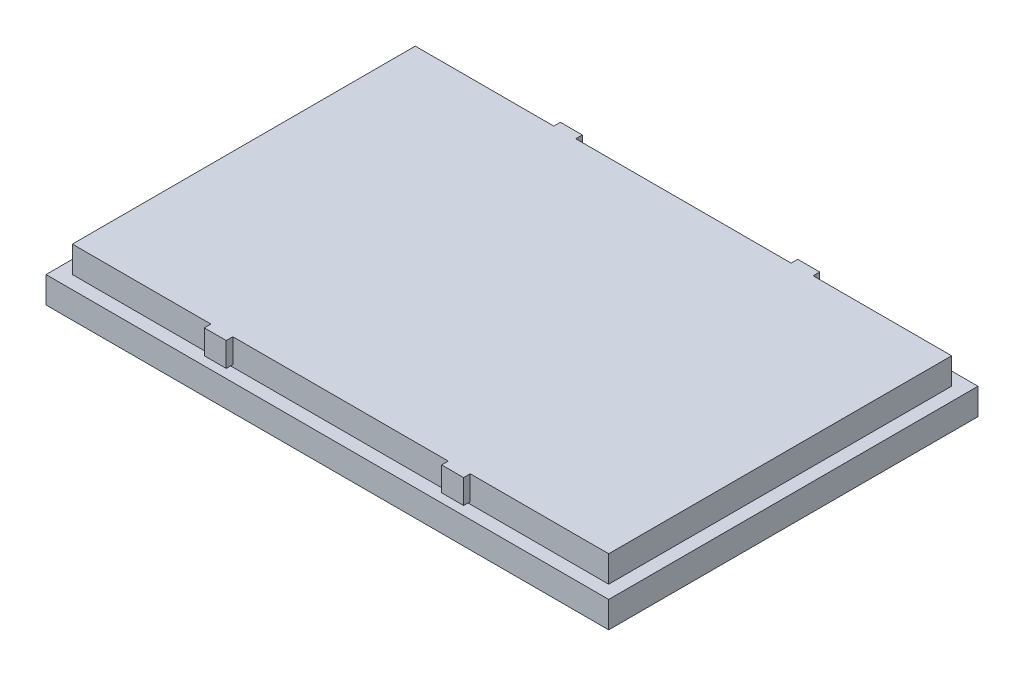
ISO-10303-21;
HEADER;
FILE_DESCRIPTION(('STEP AP214'),'2;1');
FILE_NAME('part.step','',(''),(''),'','','');
FILE_SCHEMA(('AUTOMOTIVE_DESIGN { 1 0 10303 214 1 1 1 1 }'));
ENDSEC;
DATA;
#1=APPLICATION_CONTEXT('core data for automotive mechanical design processes');
#2=APPLICATION_PROTOCOL_DEFINITION('international standard','automotive_design',2000,#1);
#3=PRODUCT_CONTEXT('',#1,'mechanical');
#4=PRODUCT('Part','Part','',(#3));
#5=PRODUCT_RELATED_PRODUCT_CATEGORY('part','',(#4));
#6=PRODUCT_DEFINITION_FORMATION('','',#4);
#7=PRODUCT_DEFINITION_CONTEXT('part definition',#1,'design');
#8=PRODUCT_DEFINITION('design','',#6,#7);
#9=PRODUCT_DEFINITION_SHAPE('','',#8);
#10=(LENGTH_UNIT() NAMED_UNIT(*) SI_UNIT(.MILLI.,.METRE.));
#11=(NAMED_UNIT(*) PLANE_ANGLE_UNIT() SI_UNIT($,.RADIAN.));
#12=(NAMED_UNIT(*) SI_UNIT($,.STERADIAN.) SOLID_ANGLE_UNIT());
#13=UNCERTAINTY_MEASURE_WITH_UNIT(LENGTH_MEASURE(1.E-05),#10,'distance_accuracy_value','');
#14=(GEOMETRIC_REPRESENTATION_CONTEXT(3) GLOBAL_UNCERTAINTY_ASSIGNED_CONTEXT((#13)) GLOBAL_UNIT_ASSIGNED_CONTEXT((#10,
#11,#12)) REPRESENTATION_CONTEXT('',''));
#15=CARTESIAN_POINT('',(0.,0.,0.));
#16=DIRECTION('',(0.,0.,1.));
#17=DIRECTION('',(1.,0.,0.));
#18=AXIS2_PLACEMENT_3D('',#15,#16,#17);
#19=CARTESIAN_POINT('',(-39.6,0.,-55.6));
#20=DIRECTION('',(0.,1.,0.));
#21=DIRECTION('',(0.,0.,1.));
#22=AXIS2_PLACEMENT_3D('',#19,#20,#21);
#23=PLANE('',#22);
#24=DIRECTION('',(0.,0.,-1.));
#25=VECTOR('',#24,1.);
#26=CARTESIAN_POINT('',(-28.3,0.,-55.6));
#27=LINE('',#26,#25);
#28=CARTESIAN_POINT('',(-28.3,0.,-71.6));
#29=VERTEX_POINT('',#28);
#30=CARTESIAN_POINT('',(-28.3,0.,-72.4));
#31=VERTEX_POINT('',#30);
#32=EDGE_CURVE('E263',#29,#31,#27,.T.);
#33=ORIENTED_EDGE('',*,*,#32,.F.);
#34=DIRECTION('',(-1.,0.,0.));
#35=VECTOR('',#34,1.);
#36=CARTESIAN_POINT('',(-39.6,0.,-71.6));
#37=LINE('',#36,#35);
#38=CARTESIAN_POINT('',(-25.3,0.,-71.6));
#39=VERTEX_POINT('',#38);
#40=EDGE_CURVE('E11',#39,#29,#37,.T.);
#41=ORIENTED_EDGE('',*,*,#40,.F.);
#42=DIRECTION('',(0.,0.,1.));
#43=VECTOR('',#42,1.);
#44=CARTESIAN_POINT('',(-25.3,0.,-55.6));
#45=LINE('',#44,#43);
#46=CARTESIAN_POINT('',(-25.3,0.,-72.4));
#47=VERTEX_POINT('',#46);
#48=EDGE_CURVE('E239',#47,#39,#45,.T.);
#49=ORIENTED_EDGE('',*,*,#48,.F.);
#50=DIRECTION('',(1.,0.,0.));
#51=VECTOR('',#50,1.);
#52=CARTESIAN_POINT('',(-39.6,0.,-72.4));
#53=LINE('',#52,#51);
#54=CARTESIAN_POINT('',(-14.,0.,-72.4));
#55=VERTEX_POINT('',#54);
#56=EDGE_CURVE('E463',#47,#55,#53,.T.);
#57=ORIENTED_EDGE('',*,*,#56,.T.);
#58=DIRECTION('',(0.,0.,-1.));
#59=VECTOR('',#58,1.);
#60=CARTESIAN_POINT('',(-14.,0.,-55.6));
#61=LINE('',#60,#59);
#62=CARTESIAN_POINT('',(-14.,0.,-55.6));
#63=VERTEX_POINT('',#62);
#64=EDGE_CURVE('E480',#63,#55,#61,.T.);
#65=ORIENTED_EDGE('',*,*,#64,.F.);
#66=DIRECTION('',(1.,0.,0.));
#67=VECTOR('',#66,1.);
#68=CARTESIAN_POINT('',(-39.6,0.,-55.6));
#69=LINE('',#68,#67);
#70=CARTESIAN_POINT('',(-39.6,0.,-55.6));
#71=VERTEX_POINT('',#70);
#72=EDGE_CURVE('E449',#71,#63,#69,.T.);
#73=ORIENTED_EDGE('',*,*,#72,.F.);
#74=DIRECTION('',(0.,0.,-1.));
#75=VECTOR('',#74,1.);
#76=CARTESIAN_POINT('',(-39.6,0.,-55.6));
#77=LINE('',#76,#75);
#78=CARTESIAN_POINT('',(-39.6,0.,-72.4));
#79=VERTEX_POINT('',#78);
#80=EDGE_CURVE('E484',#71,#79,#77,.T.);
#81=ORIENTED_EDGE('',*,*,#80,.T.);
#82=EDGE_CURVE('E464',#79,#31,#53,.T.);
#83=ORIENTED_EDGE('',*,*,#82,.T.);
#84=EDGE_LOOP('',(#33,#41,#49,#57,#65,#73,#81,#83));
#85=FACE_BOUND('',#84,.T.);
#86=ADVANCED_FACE('F47',(#85),#23,.F.);
#87=CARTESIAN_POINT('',(0.,0.,-72.4));
#88=DIRECTION('',(0.,0.,-1.));
#89=DIRECTION('',(-1.,0.,0.));
#90=AXIS2_PLACEMENT_3D('',#87,#88,#89);
#91=PLANE('',#90);
#92=DIRECTION('',(-1.,0.,0.));
#93=VECTOR('',#92,1.);
#94=CARTESIAN_POINT('',(0.,0.6,-72.4));
#95=LINE('',#94,#93);
#96=CARTESIAN_POINT('',(-25.3,0.6,-72.4));
#97=VERTEX_POINT('',#96);
#98=CARTESIAN_POINT('',(-28.3,0.6,-72.4));
#99=VERTEX_POINT('',#98);
#100=EDGE_CURVE('E249',#97,#99,#95,.T.);
#101=ORIENTED_EDGE('',*,*,#100,.T.);
#102=DIRECTION('',(0.,-1.,0.));
#103=VECTOR('',#102,1.);
#104=CARTESIAN_POINT('',(-28.3,0.,-72.4));
#105=LINE('',#104,#103);
#106=EDGE_CURVE('E56',#99,#31,#105,.T.);
#107=ORIENTED_EDGE('',*,*,#106,.T.);
#108=ORIENTED_EDGE('',*,*,#82,.F.);
#109=DIRECTION('',(0.,-1.,0.));
#110=VECTOR('',#109,1.);
#111=CARTESIAN_POINT('',(-39.6,0.,-72.4));
#112=LINE('',#111,#110);
#113=CARTESIAN_POINT('',(-39.6,1.2,-72.4));
#114=VERTEX_POINT('',#113);
#115=EDGE_CURVE('E444',#114,#79,#112,.T.);
#116=ORIENTED_EDGE('',*,*,#115,.F.);
#117=DIRECTION('',(-1.,0.,0.));
#118=VECTOR('',#117,1.);
#119=CARTESIAN_POINT('',(-39.6,1.2,-72.4));
#120=LINE('',#119,#118);
#121=CARTESIAN_POINT('',(-14.,1.2,-72.4));
#122=VERTEX_POINT('',#121);
#123=EDGE_CURVE('E450',#122,#114,#120,.T.);
#124=ORIENTED_EDGE('',*,*,#123,.F.);
#125=DIRECTION('',(0.,1.,0.));
#126=VECTOR('',#125,1.);
#127=CARTESIAN_POINT('',(-14.,0.,-72.4));
#128=LINE('',#127,#126);
#129=EDGE_CURVE('E468',#55,#122,#128,.T.);
#130=ORIENTED_EDGE('',*,*,#129,.F.);
#131=ORIENTED_EDGE('',*,*,#56,.F.);
#132=DIRECTION('',(0.,1.,0.));
#133=VECTOR('',#132,1.);
#134=CARTESIAN_POINT('',(-25.3,0.,-72.4));
#135=LINE('',#134,#133);
#136=EDGE_CURVE('E518',#47,#97,#135,.T.);
#137=ORIENTED_EDGE('',*,*,#136,.T.);
#138=EDGE_LOOP('',(#101,#107,#108,#116,#124,#130,#131,#137));
#139=FACE_BOUND('',#138,.T.);
#140=ADVANCED_FACE('F523',(#139),#91,.T.);
#141=CARTESIAN_POINT('',(0.,0.,-56.2));
#142=DIRECTION('',(0.,0.,-1.));
#143=DIRECTION('',(-1.,0.,0.));
#144=AXIS2_PLACEMENT_3D('',#141,#142,#143);
#145=PLANE('',#144);
#146=DIRECTION('',(0.,-1.,0.));
#147=VECTOR('',#146,1.);
#148=CARTESIAN_POINT('',(-32.7,0.,-56.2));
#149=LINE('',#148,#147);
#150=CARTESIAN_POINT('',(-32.7,2.4,-56.2));
#151=VERTEX_POINT('',#150);
#152=CARTESIAN_POINT('',(-32.7,1.3,-56.2));
#153=VERTEX_POINT('',#152);
#154=EDGE_CURVE('E299',#151,#153,#149,.T.);
#155=ORIENTED_EDGE('',*,*,#154,.F.);
#156=DIRECTION('',(-1.,0.,0.));
#157=VECTOR('',#156,1.);
#158=CARTESIAN_POINT('',(-39.,2.4,-56.2));
#159=LINE('',#158,#157);
#160=CARTESIAN_POINT('',(-39.,2.4,-56.2));
#161=VERTEX_POINT('',#160);
#162=EDGE_CURVE('E420',#151,#161,#159,.T.);
#163=ORIENTED_EDGE('',*,*,#162,.T.);
#164=DIRECTION('',(0.,-1.,0.));
#165=VECTOR('',#164,1.);
#166=CARTESIAN_POINT('',(-39.,1.19,-56.2));
#167=LINE('',#166,#165);
#168=CARTESIAN_POINT('',(-39.,1.2,-56.2));
#169=VERTEX_POINT('',#168);
#170=EDGE_CURVE('E412',#161,#169,#167,.T.);
#171=ORIENTED_EDGE('',*,*,#170,.T.);
#172=DIRECTION('',(1.,0.,0.));
#173=VECTOR('',#172,1.);
#174=CARTESIAN_POINT('',(-39.6,1.2,-56.2));
#175=LINE('',#174,#173);
#176=CARTESIAN_POINT('',(-14.6,1.2,-56.2));
#177=VERTEX_POINT('',#176);
#178=EDGE_CURVE('E499',#169,#177,#175,.T.);
#179=ORIENTED_EDGE('',*,*,#178,.T.);
#180=DIRECTION('',(0.,1.,0.));
#181=VECTOR('',#180,1.);
#182=CARTESIAN_POINT('',(-14.6,1.19,-56.2));
#183=LINE('',#182,#181);
#184=CARTESIAN_POINT('',(-14.6,2.4,-56.2));
#185=VERTEX_POINT('',#184);
#186=EDGE_CURVE('E416',#177,#185,#183,.T.);
#187=ORIENTED_EDGE('',*,*,#186,.T.);
#188=CARTESIAN_POINT('',(-20.9,2.4,-56.2));
#189=VERTEX_POINT('',#188);
#190=EDGE_CURVE('E421',#185,#189,#159,.T.);
#191=ORIENTED_EDGE('',*,*,#190,.T.);
#192=DIRECTION('',(0.,1.,0.));
#193=VECTOR('',#192,1.);
#194=CARTESIAN_POINT('',(-20.9,0.,-56.2));
#195=LINE('',#194,#193);
#196=CARTESIAN_POINT('',(-20.9,1.3,-56.2));
#197=VERTEX_POINT('',#196);
#198=EDGE_CURVE('E367',#197,#189,#195,.T.);
#199=ORIENTED_EDGE('',*,*,#198,.F.);
#200=DIRECTION('',(1.,0.,0.));
#201=VECTOR('',#200,1.);
#202=CARTESIAN_POINT('',(0.,1.3,-56.2));
#203=LINE('',#202,#201);
#204=CARTESIAN_POINT('',(-21.9,1.3,-56.2));
#205=VERTEX_POINT('',#204);
#206=EDGE_CURVE('E506',#205,#197,#203,.T.);
#207=ORIENTED_EDGE('',*,*,#206,.F.);
#208=DIRECTION('',(0.,-1.,0.));
#209=VECTOR('',#208,1.);
#210=CARTESIAN_POINT('',(-21.9,0.,-56.2));
#211=LINE('',#210,#209);
#212=CARTESIAN_POINT('',(-21.9,2.4,-56.2));
#213=VERTEX_POINT('',#212);
#214=EDGE_CURVE('E371',#213,#205,#211,.T.);
#215=ORIENTED_EDGE('',*,*,#214,.F.);
#216=CARTESIAN_POINT('',(-31.7,2.4,-56.2));
#217=VERTEX_POINT('',#216);
#218=EDGE_CURVE('E425',#213,#217,#159,.T.);
#219=ORIENTED_EDGE('',*,*,#218,.T.);
#220=DIRECTION('',(0.,1.,0.));
#221=VECTOR('',#220,1.);
#222=CARTESIAN_POINT('',(-31.7,0.,-56.2));
#223=LINE('',#222,#221);
#224=CARTESIAN_POINT('',(-31.7,1.3,-56.2));
#225=VERTEX_POINT('',#224);
#226=EDGE_CURVE('E295',#225,#217,#223,.T.);
#227=ORIENTED_EDGE('',*,*,#226,.F.);
#228=DIRECTION('',(1.,0.,0.));
#229=VECTOR('',#228,1.);
#230=CARTESIAN_POINT('',(0.,1.3,-56.2));
#231=LINE('',#230,#229);
#232=EDGE_CURVE('E71',#153,#225,#231,.T.);
#233=ORIENTED_EDGE('',*,*,#232,.F.);
#234=EDGE_LOOP('',(#155,#163,#171,#179,#187,#191,#199,#207,#215,#219,#227,#233));
#235=FACE_BOUND('',#234,.T.);
#236=ADVANCED_FACE('F565',(#235),#145,.F.);
#237=CARTESIAN_POINT('',(0.,0.,-71.8));
#238=DIRECTION('',(0.,0.,-1.));
#239=DIRECTION('',(-1.,0.,0.));
#240=AXIS2_PLACEMENT_3D('',#237,#238,#239);
#241=PLANE('',#240);
#242=DIRECTION('',(-1.,0.,0.));
#243=VECTOR('',#242,1.);
#244=CARTESIAN_POINT('',(-39.,2.4,-71.8));
#245=LINE('',#244,#243);
#246=CARTESIAN_POINT('',(-32.7,2.4,-71.8));
#247=VERTEX_POINT('',#246);
#248=CARTESIAN_POINT('',(-39.,2.4,-71.8));
#249=VERTEX_POINT('',#248);
#250=EDGE_CURVE('E432',#247,#249,#245,.T.);
#251=ORIENTED_EDGE('',*,*,#250,.F.);
#252=DIRECTION('',(0.,-1.,0.));
#253=VECTOR('',#252,1.);
#254=CARTESIAN_POINT('',(-32.7,0.,-71.8));
#255=LINE('',#254,#253);
#256=CARTESIAN_POINT('',(-32.7,1.3,-71.8));
#257=VERTEX_POINT('',#256);
#258=EDGE_CURVE('E334',#247,#257,#255,.T.);
#259=ORIENTED_EDGE('',*,*,#258,.T.);
#260=DIRECTION('',(1.,0.,0.));
#261=VECTOR('',#260,1.);
#262=CARTESIAN_POINT('',(0.,1.3,-71.8));
#263=LINE('',#262,#261);
#264=CARTESIAN_POINT('',(-31.7,1.3,-71.8));
#265=VERTEX_POINT('',#264);
#266=EDGE_CURVE('E510',#257,#265,#263,.T.);
#267=ORIENTED_EDGE('',*,*,#266,.T.);
#268=DIRECTION('',(0.,1.,0.));
#269=VECTOR('',#268,1.);
#270=CARTESIAN_POINT('',(-31.7,0.,-71.8));
#271=LINE('',#270,#269);
#272=CARTESIAN_POINT('',(-31.7,2.4,-71.8));
#273=VERTEX_POINT('',#272);
#274=EDGE_CURVE('E330',#265,#273,#271,.T.);
#275=ORIENTED_EDGE('',*,*,#274,.T.);
#276=CARTESIAN_POINT('',(-21.9,2.4,-71.8));
#277=VERTEX_POINT('',#276);
#278=EDGE_CURVE('E436',#277,#273,#245,.T.);
#279=ORIENTED_EDGE('',*,*,#278,.F.);
#280=DIRECTION('',(0.,-1.,0.));
#281=VECTOR('',#280,1.);
#282=CARTESIAN_POINT('',(-21.9,0.,-71.8));
#283=LINE('',#282,#281);
#284=CARTESIAN_POINT('',(-21.9,1.3,-71.8));
#285=VERTEX_POINT('',#284);
#286=EDGE_CURVE('E407',#277,#285,#283,.T.);
#287=ORIENTED_EDGE('',*,*,#286,.T.);
#288=DIRECTION('',(1.,0.,0.));
#289=VECTOR('',#288,1.);
#290=CARTESIAN_POINT('',(0.,1.3,-71.8));
#291=LINE('',#290,#289);
#292=CARTESIAN_POINT('',(-20.9,1.3,-71.8));
#293=VERTEX_POINT('',#292);
#294=EDGE_CURVE('E502',#285,#293,#291,.T.);
#295=ORIENTED_EDGE('',*,*,#294,.T.);
#296=DIRECTION('',(0.,1.,0.));
#297=VECTOR('',#296,1.);
#298=CARTESIAN_POINT('',(-20.9,0.,-71.8));
#299=LINE('',#298,#297);
#300=CARTESIAN_POINT('',(-20.9,2.4,-71.8));
#301=VERTEX_POINT('',#300);
#302=EDGE_CURVE('E403',#293,#301,#299,.T.);
#303=ORIENTED_EDGE('',*,*,#302,.T.);
#304=CARTESIAN_POINT('',(-14.6,2.4,-71.8));
#305=VERTEX_POINT('',#304);
#306=EDGE_CURVE('E417',#305,#301,#245,.T.);
#307=ORIENTED_EDGE('',*,*,#306,.F.);
#308=DIRECTION('',(0.,1.,0.));
#309=VECTOR('',#308,1.);
#310=CARTESIAN_POINT('',(-14.6,1.19,-71.8));
#311=LINE('',#310,#309);
#312=CARTESIAN_POINT('',(-14.6,1.2,-71.8));
#313=VERTEX_POINT('',#312);
#314=EDGE_CURVE('E429',#313,#305,#311,.T.);
#315=ORIENTED_EDGE('',*,*,#314,.F.);
#316=DIRECTION('',(1.,0.,0.));
#317=VECTOR('',#316,1.);
#318=CARTESIAN_POINT('',(-39.6,1.2,-71.8));
#319=LINE('',#318,#317);
#320=CARTESIAN_POINT('',(-39.,1.2,-71.8));
#321=VERTEX_POINT('',#320);
#322=EDGE_CURVE('E488',#321,#313,#319,.T.);
#323=ORIENTED_EDGE('',*,*,#322,.F.);
#324=DIRECTION('',(0.,-1.,0.));
#325=VECTOR('',#324,1.);
#326=CARTESIAN_POINT('',(-39.,1.19,-71.8));
#327=LINE('',#326,#325);
#328=EDGE_CURVE('E411',#249,#321,#327,.T.);
#329=ORIENTED_EDGE('',*,*,#328,.F.);
#330=EDGE_LOOP('',(#251,#259,#267,#275,#279,#287,#295,#303,#307,#315,#323,#329));
#331=FACE_BOUND('',#330,.T.);
#332=ADVANCED_FACE('F561',(#331),#241,.T.);
#333=CARTESIAN_POINT('',(-39.6,1.2,-55.6));
#334=DIRECTION('',(0.,-1.,0.));
#335=DIRECTION('',(0.,0.,-1.));
#336=AXIS2_PLACEMENT_3D('',#333,#334,#335);
#337=PLANE('',#336);
#338=ORIENTED_EDGE('',*,*,#123,.T.);
#339=DIRECTION('',(0.,0.,-1.));
#340=VECTOR('',#339,1.);
#341=CARTESIAN_POINT('',(-39.6,1.2,-55.6));
#342=LINE('',#341,#340);
#343=CARTESIAN_POINT('',(-39.6,1.2,-55.6));
#344=VERTEX_POINT('',#343);
#345=EDGE_CURVE('E459',#344,#114,#342,.T.);
#346=ORIENTED_EDGE('',*,*,#345,.F.);
#347=DIRECTION('',(-1.,0.,0.));
#348=VECTOR('',#347,1.);
#349=CARTESIAN_POINT('',(-39.6,1.2,-55.6));
#350=LINE('',#349,#348);
#351=CARTESIAN_POINT('',(-14.,1.2,-55.6));
#352=VERTEX_POINT('',#351);
#353=EDGE_CURVE('E456',#352,#344,#350,.T.);
#354=ORIENTED_EDGE('',*,*,#353,.F.);
#355=DIRECTION('',(0.,0.,-1.));
#356=VECTOR('',#355,1.);
#357=CARTESIAN_POINT('',(-14.,1.2,-55.6));
#358=LINE('',#357,#356);
#359=EDGE_CURVE('E476',#352,#122,#358,.T.);
#360=ORIENTED_EDGE('',*,*,#359,.T.);
#361=EDGE_LOOP('',(#338,#346,#354,#360));
#362=FACE_BOUND('',#361,.T.);
#363=ORIENTED_EDGE('',*,*,#178,.F.);
#364=DIRECTION('',(0.,0.,1.));
#365=VECTOR('',#364,1.);
#366=CARTESIAN_POINT('',(-39.,1.2,-55.6));
#367=LINE('',#366,#365);
#368=EDGE_CURVE('E496',#321,#169,#367,.T.);
#369=ORIENTED_EDGE('',*,*,#368,.F.);
#370=ORIENTED_EDGE('',*,*,#322,.T.);
#371=DIRECTION('',(0.,0.,-1.));
#372=VECTOR('',#371,1.);
#373=CARTESIAN_POINT('',(-14.6,1.2,-55.6));
#374=LINE('',#373,#372);
#375=EDGE_CURVE('E492',#177,#313,#374,.T.);
#376=ORIENTED_EDGE('',*,*,#375,.F.);
#377=EDGE_LOOP('',(#363,#369,#370,#376));
#378=FACE_BOUND('',#377,.T.);
#379=ADVANCED_FACE('F537',(#362,#378),#337,.F.);
#380=CARTESIAN_POINT('',(-39.6,0.,-55.6));
#381=DIRECTION('',(1.,0.,0.));
#382=DIRECTION('',(0.,0.,-1.));
#383=AXIS2_PLACEMENT_3D('',#380,#381,#382);
#384=PLANE('',#383);
#385=ORIENTED_EDGE('',*,*,#115,.T.);
#386=ORIENTED_EDGE('',*,*,#80,.F.);
#387=DIRECTION('',(0.,-1.,0.));
#388=VECTOR('',#387,1.);
#389=CARTESIAN_POINT('',(-39.6,0.,-55.6));
#390=LINE('',#389,#388);
#391=EDGE_CURVE('E445',#344,#71,#390,.T.);
#392=ORIENTED_EDGE('',*,*,#391,.F.);
#393=ORIENTED_EDGE('',*,*,#345,.T.);
#394=EDGE_LOOP('',(#385,#386,#392,#393));
#395=FACE_BOUND('',#394,.T.);
#396=ADVANCED_FACE('F49',(#395),#384,.F.);
#397=CARTESIAN_POINT('',(-14.,0.,-55.6));
#398=DIRECTION('',(-1.,0.,0.));
#399=DIRECTION('',(0.,0.,1.));
#400=AXIS2_PLACEMENT_3D('',#397,#398,#399);
#401=PLANE('',#400);
#402=ORIENTED_EDGE('',*,*,#129,.T.);
#403=ORIENTED_EDGE('',*,*,#359,.F.);
#404=DIRECTION('',(0.,1.,0.));
#405=VECTOR('',#404,1.);
#406=CARTESIAN_POINT('',(-14.,0.,-55.6));
#407=LINE('',#406,#405);
#408=EDGE_CURVE('E453',#63,#352,#407,.T.);
#409=ORIENTED_EDGE('',*,*,#408,.F.);
#410=ORIENTED_EDGE('',*,*,#64,.T.);
#411=EDGE_LOOP('',(#402,#403,#409,#410));
#412=FACE_BOUND('',#411,.T.);
#413=ADVANCED_FACE('F543',(#412),#401,.F.);
#414=CARTESIAN_POINT('',(0.,0.,-55.6));
#415=DIRECTION('',(0.,0.,-1.));
#416=DIRECTION('',(-1.,0.,0.));
#417=AXIS2_PLACEMENT_3D('',#414,#415,#416);
#418=PLANE('',#417);
#419=ORIENTED_EDGE('',*,*,#391,.T.);
#420=ORIENTED_EDGE('',*,*,#72,.T.);
#421=ORIENTED_EDGE('',*,*,#408,.T.);
#422=ORIENTED_EDGE('',*,*,#353,.T.);
#423=EDGE_LOOP('',(#419,#420,#421,#422));
#424=FACE_BOUND('',#423,.T.);
#425=ADVANCED_FACE('F616',(#424),#418,.F.);
#426=CARTESIAN_POINT('',(-39.,1.19,-56.2));
#427=DIRECTION('',(1.,0.,0.));
#428=DIRECTION('',(0.,0.,-1.));
#429=AXIS2_PLACEMENT_3D('',#426,#427,#428);
#430=PLANE('',#429);
#431=ORIENTED_EDGE('',*,*,#328,.T.);
#432=ORIENTED_EDGE('',*,*,#368,.T.);
#433=ORIENTED_EDGE('',*,*,#170,.F.);
#434=DIRECTION('',(0.,0.,-1.));
#435=VECTOR('',#434,1.);
#436=CARTESIAN_POINT('',(-39.,2.4,-56.2));
#437=LINE('',#436,#435);
#438=EDGE_CURVE('E424',#161,#249,#437,.T.);
#439=ORIENTED_EDGE('',*,*,#438,.T.);
#440=EDGE_LOOP('',(#431,#432,#433,#439));
#441=FACE_BOUND('',#440,.T.);
#442=ADVANCED_FACE('F559',(#441),#430,.F.);
#443=CARTESIAN_POINT('',(-14.6,1.19,-56.2));
#444=DIRECTION('',(-1.,0.,0.));
#445=DIRECTION('',(0.,0.,1.));
#446=AXIS2_PLACEMENT_3D('',#443,#444,#445);
#447=PLANE('',#446);
#448=ORIENTED_EDGE('',*,*,#186,.F.);
#449=ORIENTED_EDGE('',*,*,#375,.T.);
#450=ORIENTED_EDGE('',*,*,#314,.T.);
#451=DIRECTION('',(0.,0.,-1.));
#452=VECTOR('',#451,1.);
#453=CARTESIAN_POINT('',(-14.6,2.4,-56.2));
#454=LINE('',#453,#452);
#455=EDGE_CURVE('E440',#185,#305,#454,.T.);
#456=ORIENTED_EDGE('',*,*,#455,.F.);
#457=EDGE_LOOP('',(#448,#449,#450,#456));
#458=FACE_BOUND('',#457,.T.);
#459=ADVANCED_FACE('F624',(#458),#447,.F.);
#460=CARTESIAN_POINT('',(-39.,2.4,-56.2));
#461=DIRECTION('',(0.,-1.,0.));
#462=DIRECTION('',(0.,0.,-1.));
#463=AXIS2_PLACEMENT_3D('',#460,#461,#462);
#464=PLANE('',#463);
#465=ORIENTED_EDGE('',*,*,#162,.F.);
#466=DIRECTION('',(0.,0.,-1.));
#467=VECTOR('',#466,1.);
#468=CARTESIAN_POINT('',(-32.7,2.4,-55.9));
#469=LINE('',#468,#467);
#470=CARTESIAN_POINT('',(-32.7,2.4,-55.9));
#471=VERTEX_POINT('',#470);
#472=EDGE_CURVE('E279',#471,#151,#469,.T.);
#473=ORIENTED_EDGE('',*,*,#472,.F.);
#474=DIRECTION('',(-1.,0.,0.));
#475=VECTOR('',#474,1.);
#476=CARTESIAN_POINT('',(-32.7,2.4,-55.9));
#477=LINE('',#476,#475);
#478=CARTESIAN_POINT('',(-31.7,2.4,-55.9));
#479=VERTEX_POINT('',#478);
#480=EDGE_CURVE('E276',#479,#471,#477,.T.);
#481=ORIENTED_EDGE('',*,*,#480,.F.);
#482=DIRECTION('',(0.,0.,-1.));
#483=VECTOR('',#482,1.);
#484=CARTESIAN_POINT('',(-31.7,2.4,-55.9));
#485=LINE('',#484,#483);
#486=EDGE_CURVE('E283',#479,#217,#485,.T.);
#487=ORIENTED_EDGE('',*,*,#486,.T.);
#488=ORIENTED_EDGE('',*,*,#218,.F.);
#489=DIRECTION('',(0.,0.,-1.));
#490=VECTOR('',#489,1.);
#491=CARTESIAN_POINT('',(-21.9,2.4,-55.9));
#492=LINE('',#491,#490);
#493=CARTESIAN_POINT('',(-21.9,2.4,-55.9));
#494=VERTEX_POINT('',#493);
#495=EDGE_CURVE('E351',#494,#213,#492,.T.);
#496=ORIENTED_EDGE('',*,*,#495,.F.);
#497=DIRECTION('',(-1.,0.,0.));
#498=VECTOR('',#497,1.);
#499=CARTESIAN_POINT('',(-21.9,2.4,-55.9));
#500=LINE('',#499,#498);
#501=CARTESIAN_POINT('',(-20.9,2.4,-55.9));
#502=VERTEX_POINT('',#501);
#503=EDGE_CURVE('E348',#502,#494,#500,.T.);
#504=ORIENTED_EDGE('',*,*,#503,.F.);
#505=DIRECTION('',(0.,0.,-1.));
#506=VECTOR('',#505,1.);
#507=CARTESIAN_POINT('',(-20.9,2.4,-55.9));
#508=LINE('',#507,#506);
#509=EDGE_CURVE('E355',#502,#189,#508,.T.);
#510=ORIENTED_EDGE('',*,*,#509,.T.);
#511=ORIENTED_EDGE('',*,*,#190,.F.);
#512=ORIENTED_EDGE('',*,*,#455,.T.);
#513=ORIENTED_EDGE('',*,*,#306,.T.);
#514=DIRECTION('',(0.,0.,-1.));
#515=VECTOR('',#514,1.);
#516=CARTESIAN_POINT('',(-20.9,2.4,-71.79));
#517=LINE('',#516,#515);
#518=CARTESIAN_POINT('',(-20.9,2.4,-72.1));
#519=VERTEX_POINT('',#518);
#520=EDGE_CURVE('E394',#301,#519,#517,.T.);
#521=ORIENTED_EDGE('',*,*,#520,.T.);
#522=DIRECTION('',(-1.,0.,0.));
#523=VECTOR('',#522,1.);
#524=CARTESIAN_POINT('',(-21.9,2.4,-72.1));
#525=LINE('',#524,#523);
#526=CARTESIAN_POINT('',(-21.9,2.4,-72.1));
#527=VERTEX_POINT('',#526);
#528=EDGE_CURVE('E387',#519,#527,#525,.T.);
#529=ORIENTED_EDGE('',*,*,#528,.T.);
#530=DIRECTION('',(0.,0.,-1.));
#531=VECTOR('',#530,1.);
#532=CARTESIAN_POINT('',(-21.9,2.4,-71.79));
#533=LINE('',#532,#531);
#534=EDGE_CURVE('E391',#277,#527,#533,.T.);
#535=ORIENTED_EDGE('',*,*,#534,.F.);
#536=ORIENTED_EDGE('',*,*,#278,.T.);
#537=DIRECTION('',(0.,0.,-1.));
#538=VECTOR('',#537,1.);
#539=CARTESIAN_POINT('',(-31.7,2.4,-71.79));
#540=LINE('',#539,#538);
#541=CARTESIAN_POINT('',(-31.7,2.4,-72.1));
#542=VERTEX_POINT('',#541);
#543=EDGE_CURVE('E321',#273,#542,#540,.T.);
#544=ORIENTED_EDGE('',*,*,#543,.T.);
#545=DIRECTION('',(-1.,0.,0.));
#546=VECTOR('',#545,1.);
#547=CARTESIAN_POINT('',(-32.7,2.4,-72.1));
#548=LINE('',#547,#546);
#549=CARTESIAN_POINT('',(-32.7,2.4,-72.1));
#550=VERTEX_POINT('',#549);
#551=EDGE_CURVE('E314',#542,#550,#548,.T.);
#552=ORIENTED_EDGE('',*,*,#551,.T.);
#553=DIRECTION('',(0.,0.,-1.));
#554=VECTOR('',#553,1.);
#555=CARTESIAN_POINT('',(-32.7,2.4,-71.79));
#556=LINE('',#555,#554);
#557=EDGE_CURVE('E318',#247,#550,#556,.T.);
#558=ORIENTED_EDGE('',*,*,#557,.F.);
#559=ORIENTED_EDGE('',*,*,#250,.T.);
#560=ORIENTED_EDGE('',*,*,#438,.F.);
#561=EDGE_LOOP('',(#465,#473,#481,#487,#488,#496,#504,#510,#511,#512,#513,#521,#529,#535,#536,
#544,#552,#558,#559,#560));
#562=FACE_BOUND('',#561,.T.);
#563=ADVANCED_FACE('F553',(#562),#464,.F.);
#564=CARTESIAN_POINT('',(-21.9,1.3,-71.79));
#565=DIRECTION('',(1.,0.,0.));
#566=DIRECTION('',(0.,0.,-1.));
#567=AXIS2_PLACEMENT_3D('',#564,#565,#566);
#568=PLANE('',#567);
#569=ORIENTED_EDGE('',*,*,#286,.F.);
#570=ORIENTED_EDGE('',*,*,#534,.T.);
#571=DIRECTION('',(0.,-1.,0.));
#572=VECTOR('',#571,1.);
#573=CARTESIAN_POINT('',(-21.9,1.3,-72.1));
#574=LINE('',#573,#572);
#575=CARTESIAN_POINT('',(-21.9,1.3,-72.1));
#576=VERTEX_POINT('',#575);
#577=EDGE_CURVE('E375',#527,#576,#574,.T.);
#578=ORIENTED_EDGE('',*,*,#577,.T.);
#579=DIRECTION('',(0.,0.,-1.));
#580=VECTOR('',#579,1.);
#581=CARTESIAN_POINT('',(-21.9,1.3,-71.79));
#582=LINE('',#581,#580);
#583=EDGE_CURVE('E400',#285,#576,#582,.T.);
#584=ORIENTED_EDGE('',*,*,#583,.F.);
#585=EDGE_LOOP('',(#569,#570,#578,#584));
#586=FACE_BOUND('',#585,.T.);
#587=ADVANCED_FACE('F630',(#586),#568,.F.);
#588=CARTESIAN_POINT('',(-21.9,1.3,-71.79));
#589=DIRECTION('',(0.,1.,0.));
#590=DIRECTION('',(0.,0.,1.));
#591=AXIS2_PLACEMENT_3D('',#588,#589,#590);
#592=PLANE('',#591);
#593=ORIENTED_EDGE('',*,*,#294,.F.);
#594=ORIENTED_EDGE('',*,*,#583,.T.);
#595=DIRECTION('',(1.,0.,0.));
#596=VECTOR('',#595,1.);
#597=CARTESIAN_POINT('',(-21.9,1.3,-72.1));
#598=LINE('',#597,#596);
#599=CARTESIAN_POINT('',(-20.9,1.3,-72.1));
#600=VERTEX_POINT('',#599);
#601=EDGE_CURVE('E379',#576,#600,#598,.T.);
#602=ORIENTED_EDGE('',*,*,#601,.T.);
#603=DIRECTION('',(0.,0.,-1.));
#604=VECTOR('',#603,1.);
#605=CARTESIAN_POINT('',(-20.9,1.3,-71.79));
#606=LINE('',#605,#604);
#607=EDGE_CURVE('E397',#293,#600,#606,.T.);
#608=ORIENTED_EDGE('',*,*,#607,.F.);
#609=EDGE_LOOP('',(#593,#594,#602,#608));
#610=FACE_BOUND('',#609,.T.);
#611=ADVANCED_FACE('F637',(#610),#592,.F.);
#612=CARTESIAN_POINT('',(-20.9,1.3,-71.79));
#613=DIRECTION('',(-1.,0.,0.));
#614=DIRECTION('',(0.,0.,1.));
#615=AXIS2_PLACEMENT_3D('',#612,#613,#614);
#616=PLANE('',#615);
#617=ORIENTED_EDGE('',*,*,#302,.F.);
#618=ORIENTED_EDGE('',*,*,#607,.T.);
#619=DIRECTION('',(0.,1.,0.));
#620=VECTOR('',#619,1.);
#621=CARTESIAN_POINT('',(-20.9,1.3,-72.1));
#622=LINE('',#621,#620);
#623=EDGE_CURVE('E383',#600,#519,#622,.T.);
#624=ORIENTED_EDGE('',*,*,#623,.T.);
#625=ORIENTED_EDGE('',*,*,#520,.F.);
#626=EDGE_LOOP('',(#617,#618,#624,#625));
#627=FACE_BOUND('',#626,.T.);
#628=ADVANCED_FACE('F605',(#627),#616,.F.);
#629=CARTESIAN_POINT('',(0.,0.,-72.1));
#630=DIRECTION('',(0.,0.,-1.));
#631=DIRECTION('',(-1.,0.,0.));
#632=AXIS2_PLACEMENT_3D('',#629,#630,#631);
#633=PLANE('',#632);
#634=ORIENTED_EDGE('',*,*,#577,.F.);
#635=ORIENTED_EDGE('',*,*,#528,.F.);
#636=ORIENTED_EDGE('',*,*,#623,.F.);
#637=ORIENTED_EDGE('',*,*,#601,.F.);
#638=EDGE_LOOP('',(#634,#635,#636,#637));
#639=FACE_BOUND('',#638,.T.);
#640=ADVANCED_FACE('F598',(#639),#633,.T.);
#641=CARTESIAN_POINT('',(-21.9,1.3,-55.9));
#642=DIRECTION('',(0.,1.,0.));
#643=DIRECTION('',(0.,0.,1.));
#644=AXIS2_PLACEMENT_3D('',#641,#642,#643);
#645=PLANE('',#644);
#646=DIRECTION('',(0.,0.,-1.));
#647=VECTOR('',#646,1.);
#648=CARTESIAN_POINT('',(-21.9,1.3,-55.9));
#649=LINE('',#648,#647);
#650=CARTESIAN_POINT('',(-21.9,1.3,-55.9));
#651=VERTEX_POINT('',#650);
#652=EDGE_CURVE('E363',#651,#205,#649,.T.);
#653=ORIENTED_EDGE('',*,*,#652,.T.);
#654=ORIENTED_EDGE('',*,*,#206,.T.);
#655=DIRECTION('',(0.,0.,-1.));
#656=VECTOR('',#655,1.);
#657=CARTESIAN_POINT('',(-20.9,1.3,-55.9));
#658=LINE('',#657,#656);
#659=CARTESIAN_POINT('',(-20.9,1.3,-55.9));
#660=VERTEX_POINT('',#659);
#661=EDGE_CURVE('E359',#660,#197,#658,.T.);
#662=ORIENTED_EDGE('',*,*,#661,.F.);
#663=DIRECTION('',(1.,0.,0.));
#664=VECTOR('',#663,1.);
#665=CARTESIAN_POINT('',(-21.9,1.3,-55.9));
#666=LINE('',#665,#664);
#667=EDGE_CURVE('E342',#651,#660,#666,.T.);
#668=ORIENTED_EDGE('',*,*,#667,.F.);
#669=EDGE_LOOP('',(#653,#654,#662,#668));
#670=FACE_BOUND('',#669,.T.);
#671=ADVANCED_FACE('F596',(#670),#645,.F.);
#672=CARTESIAN_POINT('',(-21.9,1.3,-55.9));
#673=DIRECTION('',(1.,0.,0.));
#674=DIRECTION('',(0.,0.,-1.));
#675=AXIS2_PLACEMENT_3D('',#672,#673,#674);
#676=PLANE('',#675);
#677=ORIENTED_EDGE('',*,*,#495,.T.);
#678=ORIENTED_EDGE('',*,*,#214,.T.);
#679=ORIENTED_EDGE('',*,*,#652,.F.);
#680=DIRECTION('',(0.,-1.,0.));
#681=VECTOR('',#680,1.);
#682=CARTESIAN_POINT('',(-21.9,1.3,-55.9));
#683=LINE('',#682,#681);
#684=EDGE_CURVE('E338',#494,#651,#683,.T.);
#685=ORIENTED_EDGE('',*,*,#684,.F.);
#686=EDGE_LOOP('',(#677,#678,#679,#685));
#687=FACE_BOUND('',#686,.T.);
#688=ADVANCED_FACE('F586',(#687),#676,.F.);
#689=CARTESIAN_POINT('',(-20.9,1.3,-55.9));
#690=DIRECTION('',(-1.,0.,0.));
#691=DIRECTION('',(0.,0.,1.));
#692=AXIS2_PLACEMENT_3D('',#689,#690,#691);
#693=PLANE('',#692);
#694=ORIENTED_EDGE('',*,*,#661,.T.);
#695=ORIENTED_EDGE('',*,*,#198,.T.);
#696=ORIENTED_EDGE('',*,*,#509,.F.);
#697=DIRECTION('',(0.,1.,0.));
#698=VECTOR('',#697,1.);
#699=CARTESIAN_POINT('',(-20.9,1.3,-55.9));
#700=LINE('',#699,#698);
#701=EDGE_CURVE('E345',#660,#502,#700,.T.);
#702=ORIENTED_EDGE('',*,*,#701,.F.);
#703=EDGE_LOOP('',(#694,#695,#696,#702));
#704=FACE_BOUND('',#703,.T.);
#705=ADVANCED_FACE('F594',(#704),#693,.F.);
#706=CARTESIAN_POINT('',(0.,0.,-55.9));
#707=DIRECTION('',(0.,0.,-1.));
#708=DIRECTION('',(-1.,0.,0.));
#709=AXIS2_PLACEMENT_3D('',#706,#707,#708);
#710=PLANE('',#709);
#711=ORIENTED_EDGE('',*,*,#684,.T.);
#712=ORIENTED_EDGE('',*,*,#667,.T.);
#713=ORIENTED_EDGE('',*,*,#701,.T.);
#714=ORIENTED_EDGE('',*,*,#503,.T.);
#715=EDGE_LOOP('',(#711,#712,#713,#714));
#716=FACE_BOUND('',#715,.T.);
#717=ADVANCED_FACE('F588',(#716),#710,.F.);
#718=CARTESIAN_POINT('',(-32.7,1.3,-71.79));
#719=DIRECTION('',(1.,0.,0.));
#720=DIRECTION('',(0.,0.,-1.));
#721=AXIS2_PLACEMENT_3D('',#718,#719,#720);
#722=PLANE('',#721);
#723=ORIENTED_EDGE('',*,*,#258,.F.);
#724=ORIENTED_EDGE('',*,*,#557,.T.);
#725=DIRECTION('',(0.,-1.,0.));
#726=VECTOR('',#725,1.);
#727=CARTESIAN_POINT('',(-32.7,1.3,-72.1));
#728=LINE('',#727,#726);
#729=CARTESIAN_POINT('',(-32.7,1.3,-72.1));
#730=VERTEX_POINT('',#729);
#731=EDGE_CURVE('E302',#550,#730,#728,.T.);
#732=ORIENTED_EDGE('',*,*,#731,.T.);
#733=DIRECTION('',(0.,0.,-1.));
#734=VECTOR('',#733,1.);
#735=CARTESIAN_POINT('',(-32.7,1.3,-71.79));
#736=LINE('',#735,#734);
#737=EDGE_CURVE('E327',#257,#730,#736,.T.);
#738=ORIENTED_EDGE('',*,*,#737,.F.);
#739=EDGE_LOOP('',(#723,#724,#732,#738));
#740=FACE_BOUND('',#739,.T.);
#741=ADVANCED_FACE('F666',(#740),#722,.F.);
#742=CARTESIAN_POINT('',(-32.7,1.3,-71.79));
#743=DIRECTION('',(0.,1.,0.));
#744=DIRECTION('',(0.,0.,1.));
#745=AXIS2_PLACEMENT_3D('',#742,#743,#744);
#746=PLANE('',#745);
#747=ORIENTED_EDGE('',*,*,#266,.F.);
#748=ORIENTED_EDGE('',*,*,#737,.T.);
#749=DIRECTION('',(1.,0.,0.));
#750=VECTOR('',#749,1.);
#751=CARTESIAN_POINT('',(-32.7,1.3,-72.1));
#752=LINE('',#751,#750);
#753=CARTESIAN_POINT('',(-31.7,1.3,-72.1));
#754=VERTEX_POINT('',#753);
#755=EDGE_CURVE('E306',#730,#754,#752,.T.);
#756=ORIENTED_EDGE('',*,*,#755,.T.);
#757=DIRECTION('',(0.,0.,-1.));
#758=VECTOR('',#757,1.);
#759=CARTESIAN_POINT('',(-31.7,1.3,-71.79));
#760=LINE('',#759,#758);
#761=EDGE_CURVE('E324',#265,#754,#760,.T.);
#762=ORIENTED_EDGE('',*,*,#761,.F.);
#763=EDGE_LOOP('',(#747,#748,#756,#762));
#764=FACE_BOUND('',#763,.T.);
#765=ADVANCED_FACE('F668',(#764),#746,.F.);
#766=CARTESIAN_POINT('',(-31.7,1.3,-71.79));
#767=DIRECTION('',(-1.,0.,0.));
#768=DIRECTION('',(0.,0.,1.));
#769=AXIS2_PLACEMENT_3D('',#766,#767,#768);
#770=PLANE('',#769);
#771=ORIENTED_EDGE('',*,*,#274,.F.);
#772=ORIENTED_EDGE('',*,*,#761,.T.);
#773=DIRECTION('',(0.,1.,0.));
#774=VECTOR('',#773,1.);
#775=CARTESIAN_POINT('',(-31.7,1.3,-72.1));
#776=LINE('',#775,#774);
#777=EDGE_CURVE('E310',#754,#542,#776,.T.);
#778=ORIENTED_EDGE('',*,*,#777,.T.);
#779=ORIENTED_EDGE('',*,*,#543,.F.);
#780=EDGE_LOOP('',(#771,#772,#778,#779));
#781=FACE_BOUND('',#780,.T.);
#782=ADVANCED_FACE('F659',(#781),#770,.F.);
#783=CARTESIAN_POINT('',(0.,0.,-72.1));
#784=DIRECTION('',(0.,0.,-1.));
#785=DIRECTION('',(-1.,0.,0.));
#786=AXIS2_PLACEMENT_3D('',#783,#784,#785);
#787=PLANE('',#786);
#788=ORIENTED_EDGE('',*,*,#731,.F.);
#789=ORIENTED_EDGE('',*,*,#551,.F.);
#790=ORIENTED_EDGE('',*,*,#777,.F.);
#791=ORIENTED_EDGE('',*,*,#755,.F.);
#792=EDGE_LOOP('',(#788,#789,#790,#791));
#793=FACE_BOUND('',#792,.T.);
#794=ADVANCED_FACE('F663',(#793),#787,.T.);
#795=CARTESIAN_POINT('',(-32.7,1.3,-55.9));
#796=DIRECTION('',(0.,1.,0.));
#797=DIRECTION('',(0.,0.,1.));
#798=AXIS2_PLACEMENT_3D('',#795,#796,#797);
#799=PLANE('',#798);
#800=DIRECTION('',(0.,0.,-1.));
#801=VECTOR('',#800,1.);
#802=CARTESIAN_POINT('',(-32.7,1.3,-55.9));
#803=LINE('',#802,#801);
#804=CARTESIAN_POINT('',(-32.7,1.3,-55.9));
#805=VERTEX_POINT('',#804);
#806=EDGE_CURVE('E291',#805,#153,#803,.T.);
#807=ORIENTED_EDGE('',*,*,#806,.T.);
#808=ORIENTED_EDGE('',*,*,#232,.T.);
#809=DIRECTION('',(0.,0.,-1.));
#810=VECTOR('',#809,1.);
#811=CARTESIAN_POINT('',(-31.7,1.3,-55.9));
#812=LINE('',#811,#810);
#813=CARTESIAN_POINT('',(-31.7,1.3,-55.9));
#814=VERTEX_POINT('',#813);
#815=EDGE_CURVE('E287',#814,#225,#812,.T.);
#816=ORIENTED_EDGE('',*,*,#815,.F.);
#817=DIRECTION('',(1.,0.,0.));
#818=VECTOR('',#817,1.);
#819=CARTESIAN_POINT('',(-32.7,1.3,-55.9));
#820=LINE('',#819,#818);
#821=EDGE_CURVE('E270',#805,#814,#820,.T.);
#822=ORIENTED_EDGE('',*,*,#821,.F.);
#823=EDGE_LOOP('',(#807,#808,#816,#822));
#824=FACE_BOUND('',#823,.T.);
#825=ADVANCED_FACE('F715',(#824),#799,.F.);
#826=CARTESIAN_POINT('',(-32.7,1.3,-55.9));
#827=DIRECTION('',(1.,0.,0.));
#828=DIRECTION('',(0.,0.,-1.));
#829=AXIS2_PLACEMENT_3D('',#826,#827,#828);
#830=PLANE('',#829);
#831=ORIENTED_EDGE('',*,*,#472,.T.);
#832=ORIENTED_EDGE('',*,*,#154,.T.);
#833=ORIENTED_EDGE('',*,*,#806,.F.);
#834=DIRECTION('',(0.,-1.,0.));
#835=VECTOR('',#834,1.);
#836=CARTESIAN_POINT('',(-32.7,1.3,-55.9));
#837=LINE('',#836,#835);
#838=EDGE_CURVE('E266',#471,#805,#837,.T.);
#839=ORIENTED_EDGE('',*,*,#838,.F.);
#840=EDGE_LOOP('',(#831,#832,#833,#839));
#841=FACE_BOUND('',#840,.T.);
#842=ADVANCED_FACE('F572',(#841),#830,.F.);
#843=CARTESIAN_POINT('',(-31.7,1.3,-55.9));
#844=DIRECTION('',(-1.,0.,0.));
#845=DIRECTION('',(0.,0.,1.));
#846=AXIS2_PLACEMENT_3D('',#843,#844,#845);
#847=PLANE('',#846);
#848=ORIENTED_EDGE('',*,*,#815,.T.);
#849=ORIENTED_EDGE('',*,*,#226,.T.);
#850=ORIENTED_EDGE('',*,*,#486,.F.);
#851=DIRECTION('',(0.,1.,0.));
#852=VECTOR('',#851,1.);
#853=CARTESIAN_POINT('',(-31.7,1.3,-55.9));
#854=LINE('',#853,#852);
#855=EDGE_CURVE('E273',#814,#479,#854,.T.);
#856=ORIENTED_EDGE('',*,*,#855,.F.);
#857=EDGE_LOOP('',(#848,#849,#850,#856));
#858=FACE_BOUND('',#857,.T.);
#859=ADVANCED_FACE('F579',(#858),#847,.F.);
#860=CARTESIAN_POINT('',(0.,0.,-55.9));
#861=DIRECTION('',(0.,0.,-1.));
#862=DIRECTION('',(-1.,0.,0.));
#863=AXIS2_PLACEMENT_3D('',#860,#861,#862);
#864=PLANE('',#863);
#865=ORIENTED_EDGE('',*,*,#838,.T.);
#866=ORIENTED_EDGE('',*,*,#821,.T.);
#867=ORIENTED_EDGE('',*,*,#855,.T.);
#868=ORIENTED_EDGE('',*,*,#480,.T.);
#869=EDGE_LOOP('',(#865,#866,#867,#868));
#870=FACE_BOUND('',#869,.T.);
#871=ADVANCED_FACE('F574',(#870),#864,.F.);
#872=CARTESIAN_POINT('',(0.,0.,-71.6));
#873=DIRECTION('',(0.,0.,-1.));
#874=DIRECTION('',(-1.,0.,0.));
#875=AXIS2_PLACEMENT_3D('',#872,#873,#874);
#876=PLANE('',#875);
#877=ORIENTED_EDGE('',*,*,#40,.T.);
#878=DIRECTION('',(0.,-1.,0.));
#879=VECTOR('',#878,1.);
#880=CARTESIAN_POINT('',(-28.3,-0.1,-71.6));
#881=LINE('',#880,#879);
#882=CARTESIAN_POINT('',(-28.3,0.6,-71.6));
#883=VERTEX_POINT('',#882);
#884=EDGE_CURVE('E245',#883,#29,#881,.T.);
#885=ORIENTED_EDGE('',*,*,#884,.F.);
#886=DIRECTION('',(-1.,0.,0.));
#887=VECTOR('',#886,1.);
#888=CARTESIAN_POINT('',(-28.3,0.6,-71.6));
#889=LINE('',#888,#887);
#890=CARTESIAN_POINT('',(-25.3,0.6,-71.6));
#891=VERTEX_POINT('',#890);
#892=EDGE_CURVE('E244',#891,#883,#889,.T.);
#893=ORIENTED_EDGE('',*,*,#892,.F.);
#894=DIRECTION('',(0.,1.,0.));
#895=VECTOR('',#894,1.);
#896=CARTESIAN_POINT('',(-25.3,-0.1,-71.6));
#897=LINE('',#896,#895);
#898=EDGE_CURVE('E233',#39,#891,#897,.T.);
#899=ORIENTED_EDGE('',*,*,#898,.F.);
#900=EDGE_LOOP('',(#877,#885,#893,#899));
#901=FACE_BOUND('',#900,.T.);
#902=ADVANCED_FACE('F253',(#901),#876,.T.);
#903=CARTESIAN_POINT('',(-28.3,-0.1,-71.6));
#904=DIRECTION('',(1.,0.,0.));
#905=DIRECTION('',(0.,0.,-1.));
#906=AXIS2_PLACEMENT_3D('',#903,#904,#905);
#907=PLANE('',#906);
#908=ORIENTED_EDGE('',*,*,#32,.T.);
#909=ORIENTED_EDGE('',*,*,#106,.F.);
#910=DIRECTION('',(0.,0.,-1.));
#911=VECTOR('',#910,1.);
#912=CARTESIAN_POINT('',(-28.3,0.6,-71.6));
#913=LINE('',#912,#911);
#914=EDGE_CURVE('E63',#883,#99,#913,.T.);
#915=ORIENTED_EDGE('',*,*,#914,.F.);
#916=ORIENTED_EDGE('',*,*,#884,.T.);
#917=EDGE_LOOP('',(#908,#909,#915,#916));
#918=FACE_BOUND('',#917,.T.);
#919=ADVANCED_FACE('F746',(#918),#907,.T.);
#920=CARTESIAN_POINT('',(-25.3,-0.1,-71.6));
#921=DIRECTION('',(-1.,0.,0.));
#922=DIRECTION('',(0.,0.,1.));
#923=AXIS2_PLACEMENT_3D('',#920,#921,#922);
#924=PLANE('',#923);
#925=ORIENTED_EDGE('',*,*,#48,.T.);
#926=ORIENTED_EDGE('',*,*,#898,.T.);
#927=DIRECTION('',(0.,0.,-1.));
#928=VECTOR('',#927,1.);
#929=CARTESIAN_POINT('',(-25.3,0.6,-71.6));
#930=LINE('',#929,#928);
#931=EDGE_CURVE('E236',#891,#97,#930,.T.);
#932=ORIENTED_EDGE('',*,*,#931,.T.);
#933=ORIENTED_EDGE('',*,*,#136,.F.);
#934=EDGE_LOOP('',(#925,#926,#932,#933));
#935=FACE_BOUND('',#934,.T.);
#936=ADVANCED_FACE('F235',(#935),#924,.T.);
#937=CARTESIAN_POINT('',(-28.3,0.6,-71.6));
#938=DIRECTION('',(0.,-1.,0.));
#939=DIRECTION('',(0.,0.,-1.));
#940=AXIS2_PLACEMENT_3D('',#937,#938,#939);
#941=PLANE('',#940);
#942=ORIENTED_EDGE('',*,*,#931,.F.);
#943=ORIENTED_EDGE('',*,*,#892,.T.);
#944=ORIENTED_EDGE('',*,*,#914,.T.);
#945=ORIENTED_EDGE('',*,*,#100,.F.);
#946=EDGE_LOOP('',(#942,#943,#944,#945));
#947=FACE_BOUND('',#946,.T.);
#948=ADVANCED_FACE('F247',(#947),#941,.T.);
#949=CLOSED_SHELL('',(#86,#140,#236,#332,#379,#396,#413,#425,#442,#459,#563,#587,#611,#628,#640,
#671,#688,#705,#717,#741,#765,#782,#794,#825,#842,#859,#871,#902,#919,#936,#948));
#950=MANIFOLD_SOLID_BREP('B2',#949);
#951=ADVANCED_BREP_SHAPE_REPRESENTATION('',(#18,#950),#14);
#952=SHAPE_DEFINITION_REPRESENTATION(#9,#951);
ENDSEC;
END-ISO-10303-21;
